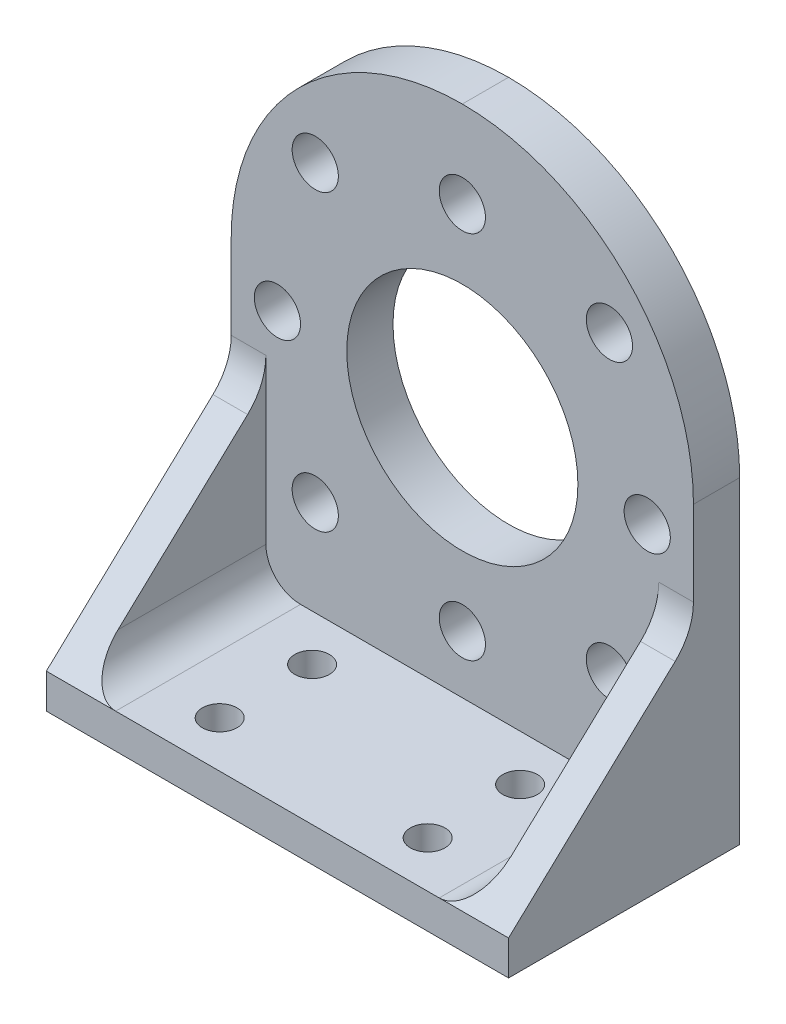
ISO-10303-21;
HEADER;
FILE_DESCRIPTION(('STEP AP214'),'2;1');
FILE_NAME('part.step','',(''),(''),'','','');
FILE_SCHEMA(('AUTOMOTIVE_DESIGN { 1 0 10303 214 1 1 1 1 }'));
ENDSEC;
DATA;
#1=APPLICATION_CONTEXT('core data for automotive mechanical design processes');
#2=APPLICATION_PROTOCOL_DEFINITION('international standard','automotive_design',2000,#1);
#3=PRODUCT_CONTEXT('',#1,'mechanical');
#4=PRODUCT('Part','Part','',(#3));
#5=PRODUCT_RELATED_PRODUCT_CATEGORY('part','',(#4));
#6=PRODUCT_DEFINITION_FORMATION('','',#4);
#7=PRODUCT_DEFINITION_CONTEXT('part definition',#1,'design');
#8=PRODUCT_DEFINITION('design','',#6,#7);
#9=PRODUCT_DEFINITION_SHAPE('','',#8);
#10=(LENGTH_UNIT() NAMED_UNIT(*) SI_UNIT(.MILLI.,.METRE.));
#11=(NAMED_UNIT(*) PLANE_ANGLE_UNIT() SI_UNIT($,.RADIAN.));
#12=(NAMED_UNIT(*) SI_UNIT($,.STERADIAN.) SOLID_ANGLE_UNIT());
#13=UNCERTAINTY_MEASURE_WITH_UNIT(LENGTH_MEASURE(1.E-05),#10,'distance_accuracy_value','');
#14=(GEOMETRIC_REPRESENTATION_CONTEXT(3) GLOBAL_UNCERTAINTY_ASSIGNED_CONTEXT((#13)) GLOBAL_UNIT_ASSIGNED_CONTEXT((#10,
#11,#12)) REPRESENTATION_CONTEXT('',''));
#15=CARTESIAN_POINT('',(0.,0.,0.));
#16=DIRECTION('',(0.,0.,1.));
#17=DIRECTION('',(1.,0.,0.));
#18=AXIS2_PLACEMENT_3D('',#15,#16,#17);
#19=CARTESIAN_POINT('',(0.,3.,0.));
#20=DIRECTION('',(0.,-1.,0.));
#21=DIRECTION('',(0.,0.,-1.));
#22=AXIS2_PLACEMENT_3D('',#19,#20,#21);
#23=PLANE('',#22);
#24=CARTESIAN_POINT('',(-9.,3.,6.));
#25=DIRECTION('',(0.,1.,0.));
#26=DIRECTION('',(0.,0.,-1.));
#27=AXIS2_PLACEMENT_3D('',#24,#25,#26);
#28=CIRCLE('',#27,1.5);
#29=CARTESIAN_POINT('',(-9.,3.,4.49999999999999));
#30=VERTEX_POINT('',#29);
#31=EDGE_CURVE('E618',#30,#30,#28,.T.);
#32=ORIENTED_EDGE('',*,*,#31,.F.);
#33=EDGE_LOOP('',(#32));
#34=FACE_BOUND('',#33,.T.);
#35=CARTESIAN_POINT('',(9.,3.,6.));
#36=DIRECTION('',(0.,1.,0.));
#37=DIRECTION('',(0.,0.,1.));
#38=AXIS2_PLACEMENT_3D('',#35,#36,#37);
#39=CIRCLE('',#38,1.49999999999999);
#40=CARTESIAN_POINT('',(9.,3.,7.49999999999999));
#41=VERTEX_POINT('',#40);
#42=EDGE_CURVE('E648',#41,#41,#39,.T.);
#43=ORIENTED_EDGE('',*,*,#42,.F.);
#44=EDGE_LOOP('',(#43));
#45=FACE_BOUND('',#44,.T.);
#46=CARTESIAN_POINT('',(9.,3.,-2.));
#47=DIRECTION('',(0.,1.,0.));
#48=DIRECTION('',(0.,0.,-1.));
#49=AXIS2_PLACEMENT_3D('',#46,#47,#48);
#50=CIRCLE('',#49,1.49999999999999);
#51=CARTESIAN_POINT('',(9.,3.,-3.49999999999999));
#52=VERTEX_POINT('',#51);
#53=EDGE_CURVE('E642',#52,#52,#50,.T.);
#54=ORIENTED_EDGE('',*,*,#53,.F.);
#55=EDGE_LOOP('',(#54));
#56=FACE_BOUND('',#55,.T.);
#57=CARTESIAN_POINT('',(-9.,3.,-2.));
#58=DIRECTION('',(0.,1.,0.));
#59=DIRECTION('',(0.,0.,1.));
#60=AXIS2_PLACEMENT_3D('',#57,#58,#59);
#61=CIRCLE('',#60,1.5);
#62=CARTESIAN_POINT('',(-9.,3.,-0.500000000000004));
#63=VERTEX_POINT('',#62);
#64=EDGE_CURVE('E641',#63,#63,#61,.T.);
#65=ORIENTED_EDGE('',*,*,#64,.F.);
#66=EDGE_LOOP('',(#65));
#67=FACE_BOUND('',#66,.T.);
#68=DIRECTION('',(1.,0.,0.));
#69=VECTOR('',#68,1.);
#70=CARTESIAN_POINT('',(-20.,3.,10.));
#71=LINE('',#70,#69);
#72=CARTESIAN_POINT('',(-14.,3.,9.99999999999999));
#73=VERTEX_POINT('',#72);
#74=CARTESIAN_POINT('',(14.,3.,10.));
#75=VERTEX_POINT('',#74);
#76=EDGE_CURVE('E159',#73,#75,#71,.T.);
#77=ORIENTED_EDGE('',*,*,#76,.T.);
#78=DIRECTION('',(0.,0.,1.));
#79=VECTOR('',#78,1.);
#80=CARTESIAN_POINT('',(14.,3.,-6.));
#81=LINE('',#80,#79);
#82=CARTESIAN_POINT('',(14.,3.,-6.));
#83=VERTEX_POINT('',#82);
#84=EDGE_CURVE('E212',#75,#83,#81,.F.);
#85=ORIENTED_EDGE('',*,*,#84,.T.);
#86=DIRECTION('',(1.,0.,0.));
#87=VECTOR('',#86,1.);
#88=CARTESIAN_POINT('',(-20.,3.,-6.));
#89=LINE('',#88,#87);
#90=CARTESIAN_POINT('',(-14.,3.,-6.));
#91=VERTEX_POINT('',#90);
#92=EDGE_CURVE('E270',#91,#83,#89,.T.);
#93=ORIENTED_EDGE('',*,*,#92,.F.);
#94=DIRECTION('',(0.,0.,-1.));
#95=VECTOR('',#94,1.);
#96=CARTESIAN_POINT('',(-14.,3.,9.99999999999999));
#97=LINE('',#96,#95);
#98=EDGE_CURVE('E209',#91,#73,#97,.F.);
#99=ORIENTED_EDGE('',*,*,#98,.T.);
#100=EDGE_LOOP('',(#77,#85,#93,#99));
#101=FACE_BOUND('',#100,.T.);
#102=ADVANCED_FACE('F38',(#34,#45,#56,#67,#101),#23,.F.);
#103=CARTESIAN_POINT('',(-20.,47.5,-6.));
#104=DIRECTION('',(0.,0.,-1.));
#105=DIRECTION('',(-1.,0.,0.));
#106=AXIS2_PLACEMENT_3D('',#103,#104,#105);
#107=PLANE('',#106);
#108=CARTESIAN_POINT('',(0.,40.,-6.));
#109=DIRECTION('',(0.,0.,1.));
#110=DIRECTION('',(1.,0.,0.));
#111=AXIS2_PLACEMENT_3D('',#108,#109,#110);
#112=CIRCLE('',#111,2.);
#113=CARTESIAN_POINT('',(2.,40.,-6.));
#114=VERTEX_POINT('',#113);
#115=EDGE_CURVE('E615',#114,#114,#112,.T.);
#116=ORIENTED_EDGE('',*,*,#115,.F.);
#117=EDGE_LOOP('',(#116));
#118=FACE_BOUND('',#117,.T.);
#119=CARTESIAN_POINT('',(-15.9999999999998,23.9999999999997,-6.));
#120=DIRECTION('',(0.,0.,1.));
#121=DIRECTION('',(1.,0.,0.));
#122=AXIS2_PLACEMENT_3D('',#119,#120,#121);
#123=CIRCLE('',#122,2.);
#124=CARTESIAN_POINT('',(-13.9999999999998,23.9999999999997,-6.));
#125=VERTEX_POINT('',#124);
#126=EDGE_CURVE('E621',#125,#125,#123,.T.);
#127=ORIENTED_EDGE('',*,*,#126,.F.);
#128=EDGE_LOOP('',(#127));
#129=FACE_BOUND('',#128,.T.);
#130=CARTESIAN_POINT('',(0.,8.,-6.));
#131=DIRECTION('',(0.,0.,1.));
#132=DIRECTION('',(1.,0.,0.));
#133=AXIS2_PLACEMENT_3D('',#130,#131,#132);
#134=CIRCLE('',#133,1.99999999999946);
#135=CARTESIAN_POINT('',(1.99999999999946,8.,-6.));
#136=VERTEX_POINT('',#135);
#137=EDGE_CURVE('E629',#136,#136,#134,.T.);
#138=ORIENTED_EDGE('',*,*,#137,.F.);
#139=EDGE_LOOP('',(#138));
#140=FACE_BOUND('',#139,.T.);
#141=CARTESIAN_POINT('',(16.0000000000002,24.0000000000004,-6.));
#142=DIRECTION('',(0.,0.,1.));
#143=DIRECTION('',(1.,0.,0.));
#144=AXIS2_PLACEMENT_3D('',#141,#142,#143);
#145=CIRCLE('',#144,2.);
#146=CARTESIAN_POINT('',(18.0000000000002,24.0000000000004,-6.));
#147=VERTEX_POINT('',#146);
#148=EDGE_CURVE('E635',#147,#147,#145,.T.);
#149=ORIENTED_EDGE('',*,*,#148,.F.);
#150=EDGE_LOOP('',(#149));
#151=FACE_BOUND('',#150,.T.);
#152=CARTESIAN_POINT('',(0.,24.,-6.));
#153=DIRECTION('',(0.,0.,1.));
#154=DIRECTION('',(1.,0.,0.));
#155=AXIS2_PLACEMENT_3D('',#152,#153,#154);
#156=CIRCLE('',#155,10.);
#157=CARTESIAN_POINT('',(10.,24.,-6.));
#158=VERTEX_POINT('',#157);
#159=EDGE_CURVE('E246',#158,#158,#156,.T.);
#160=ORIENTED_EDGE('',*,*,#159,.F.);
#161=EDGE_LOOP('',(#160));
#162=FACE_BOUND('',#161,.T.);
#163=CARTESIAN_POINT('',(-12.7279220613579,11.2720779386422,-6.));
#164=DIRECTION('',(0.,0.,1.));
#165=DIRECTION('',(1.,0.,0.));
#166=AXIS2_PLACEMENT_3D('',#163,#164,#165);
#167=CIRCLE('',#166,2.);
#168=CARTESIAN_POINT('',(-10.7279220613579,11.2720779386422,-6.));
#169=VERTEX_POINT('',#168);
#170=EDGE_CURVE('E259',#169,#169,#167,.T.);
#171=ORIENTED_EDGE('',*,*,#170,.F.);
#172=EDGE_LOOP('',(#171));
#173=FACE_BOUND('',#172,.T.);
#174=CARTESIAN_POINT('',(12.7279220613578,11.2720779386421,-6.));
#175=DIRECTION('',(0.,0.,1.));
#176=DIRECTION('',(1.,0.,0.));
#177=AXIS2_PLACEMENT_3D('',#174,#175,#176);
#178=CIRCLE('',#177,2.00000000000006);
#179=CARTESIAN_POINT('',(14.7279220613579,11.2720779386421,-6.));
#180=VERTEX_POINT('',#179);
#181=EDGE_CURVE('E253',#180,#180,#178,.T.);
#182=ORIENTED_EDGE('',*,*,#181,.F.);
#183=EDGE_LOOP('',(#182));
#184=FACE_BOUND('',#183,.T.);
#185=ORIENTED_EDGE('',*,*,#92,.T.);
#186=CARTESIAN_POINT('',(14.,6.,-6.));
#187=DIRECTION('',(0.,0.,-1.));
#188=DIRECTION('',(-1.,0.,0.));
#189=AXIS2_PLACEMENT_3D('',#186,#187,#188);
#190=CIRCLE('',#189,3.);
#191=CARTESIAN_POINT('',(17.,6.,-6.));
#192=VERTEX_POINT('',#191);
#193=EDGE_CURVE('E216',#83,#192,#190,.F.);
#194=ORIENTED_EDGE('',*,*,#193,.T.);
#195=DIRECTION('',(0.,-1.,0.));
#196=VECTOR('',#195,1.);
#197=CARTESIAN_POINT('',(17.,18.,-6.));
#198=LINE('',#197,#196);
#199=CARTESIAN_POINT('',(17.,20.1661600623316,-6.));
#200=VERTEX_POINT('',#199);
#201=EDGE_CURVE('E237',#200,#192,#198,.T.);
#202=ORIENTED_EDGE('',*,*,#201,.F.);
#203=DIRECTION('',(-1.,0.,0.));
#204=VECTOR('',#203,1.);
#205=CARTESIAN_POINT('',(20.,20.1661600623316,-6.));
#206=LINE('',#205,#204);
#207=CARTESIAN_POINT('',(20.,20.1661600623316,-6.));
#208=VERTEX_POINT('',#207);
#209=EDGE_CURVE('E193',#200,#208,#206,.F.);
#210=ORIENTED_EDGE('',*,*,#209,.T.);
#211=DIRECTION('',(0.,-1.,0.));
#212=VECTOR('',#211,1.);
#213=CARTESIAN_POINT('',(20.,47.5,-6.));
#214=LINE('',#213,#212);
#215=CARTESIAN_POINT('',(20.,27.5,-6.));
#216=VERTEX_POINT('',#215);
#217=EDGE_CURVE('E274',#216,#208,#214,.T.);
#218=ORIENTED_EDGE('',*,*,#217,.F.);
#219=CARTESIAN_POINT('',(0.,27.5,-6.));
#220=DIRECTION('',(0.,0.,-1.));
#221=DIRECTION('',(-1.,0.,0.));
#222=AXIS2_PLACEMENT_3D('',#219,#220,#221);
#223=CIRCLE('',#222,20.);
#224=CARTESIAN_POINT('',(0.,47.5,-6.));
#225=VERTEX_POINT('',#224);
#226=EDGE_CURVE('E179',#216,#225,#223,.F.);
#227=ORIENTED_EDGE('',*,*,#226,.T.);
#228=CARTESIAN_POINT('',(0.,27.5,-6.));
#229=DIRECTION('',(0.,0.,-1.));
#230=DIRECTION('',(-1.,0.,0.));
#231=AXIS2_PLACEMENT_3D('',#228,#229,#230);
#232=CIRCLE('',#231,20.);
#233=CARTESIAN_POINT('',(-20.,27.5,-6.));
#234=VERTEX_POINT('',#233);
#235=EDGE_CURVE('E177',#225,#234,#232,.F.);
#236=ORIENTED_EDGE('',*,*,#235,.T.);
#237=DIRECTION('',(0.,-1.,0.));
#238=VECTOR('',#237,1.);
#239=CARTESIAN_POINT('',(-20.,47.5,-6.));
#240=LINE('',#239,#238);
#241=CARTESIAN_POINT('',(-20.,20.1661600623316,-6.));
#242=VERTEX_POINT('',#241);
#243=EDGE_CURVE('E276',#234,#242,#240,.T.);
#244=ORIENTED_EDGE('',*,*,#243,.T.);
#245=DIRECTION('',(-1.,0.,0.));
#246=VECTOR('',#245,1.);
#247=CARTESIAN_POINT('',(-17.,20.1661600623316,-6.));
#248=LINE('',#247,#246);
#249=CARTESIAN_POINT('',(-17.,20.1661600623316,-6.));
#250=VERTEX_POINT('',#249);
#251=EDGE_CURVE('E190',#242,#250,#248,.F.);
#252=ORIENTED_EDGE('',*,*,#251,.T.);
#253=DIRECTION('',(0.,-1.,0.));
#254=VECTOR('',#253,1.);
#255=CARTESIAN_POINT('',(-17.,18.,-6.));
#256=LINE('',#255,#254);
#257=CARTESIAN_POINT('',(-17.,6.,-6.));
#258=VERTEX_POINT('',#257);
#259=EDGE_CURVE('E188',#250,#258,#256,.T.);
#260=ORIENTED_EDGE('',*,*,#259,.T.);
#261=CARTESIAN_POINT('',(-14.,6.,-6.));
#262=DIRECTION('',(0.,0.,-1.));
#263=DIRECTION('',(-1.,0.,0.));
#264=AXIS2_PLACEMENT_3D('',#261,#262,#263);
#265=CIRCLE('',#264,3.);
#266=EDGE_CURVE('E214',#258,#91,#265,.F.);
#267=ORIENTED_EDGE('',*,*,#266,.T.);
#268=EDGE_LOOP('',(#185,#194,#202,#210,#218,#227,#236,#244,#252,#260,#267));
#269=FACE_BOUND('',#268,.T.);
#270=CARTESIAN_POINT('',(12.7279220613579,36.7279220613578,-6.));
#271=DIRECTION('',(0.,0.,1.));
#272=DIRECTION('',(1.,0.,0.));
#273=AXIS2_PLACEMENT_3D('',#270,#271,#272);
#274=CIRCLE('',#273,1.99999999999998);
#275=CARTESIAN_POINT('',(14.7279220613579,36.7279220613578,-6.));
#276=VERTEX_POINT('',#275);
#277=EDGE_CURVE('E247',#276,#276,#274,.T.);
#278=ORIENTED_EDGE('',*,*,#277,.F.);
#279=EDGE_LOOP('',(#278));
#280=FACE_BOUND('',#279,.T.);
#281=CARTESIAN_POINT('',(-12.7279220613578,36.7279220613579,-6.));
#282=DIRECTION('',(0.,0.,1.));
#283=DIRECTION('',(1.,0.,0.));
#284=AXIS2_PLACEMENT_3D('',#281,#282,#283);
#285=CIRCLE('',#284,1.99999999999995);
#286=CARTESIAN_POINT('',(-10.7279220613579,36.7279220613579,-6.));
#287=VERTEX_POINT('',#286);
#288=EDGE_CURVE('E187',#287,#287,#285,.T.);
#289=ORIENTED_EDGE('',*,*,#288,.F.);
#290=EDGE_LOOP('',(#289));
#291=FACE_BOUND('',#290,.T.);
#292=ADVANCED_FACE('F231',(#118,#129,#140,#151,#162,#173,#184,#269,#280,#291),#107,.F.);
#293=CARTESIAN_POINT('',(20.,3.,10.));
#294=DIRECTION('',(-1.,0.,0.));
#295=DIRECTION('',(0.,0.,1.));
#296=AXIS2_PLACEMENT_3D('',#293,#294,#295);
#297=PLANE('',#296);
#298=ORIENTED_EDGE('',*,*,#217,.T.);
#299=CARTESIAN_POINT('',(20.,20.1661600623316,-0.999999999999998));
#300=DIRECTION('',(-1.,0.,0.));
#301=DIRECTION('',(0.,0.,1.));
#302=AXIS2_PLACEMENT_3D('',#299,#300,#301);
#303=CIRCLE('',#302,5.);
#304=CARTESIAN_POINT('',(20.,16.5184740416312,-4.41970564440665));
#305=VERTEX_POINT('',#304);
#306=EDGE_CURVE('E141',#208,#305,#303,.T.);
#307=ORIENTED_EDGE('',*,*,#306,.T.);
#308=DIRECTION('',(0.,-0.68394112888133,0.729537204140085));
#309=VECTOR('',#308,1.);
#310=CARTESIAN_POINT('',(20.,18.,-6.00000000000001));
#311=LINE('',#310,#309);
#312=CARTESIAN_POINT('',(20.,3.,9.99999999999999));
#313=VERTEX_POINT('',#312);
#314=EDGE_CURVE('E134',#305,#313,#311,.T.);
#315=ORIENTED_EDGE('',*,*,#314,.T.);
#316=DIRECTION('',(0.,-1.,0.));
#317=VECTOR('',#316,1.);
#318=CARTESIAN_POINT('',(20.,3.,10.));
#319=LINE('',#318,#317);
#320=CARTESIAN_POINT('',(20.,0.,10.));
#321=VERTEX_POINT('',#320);
#322=EDGE_CURVE('E138',#313,#321,#319,.T.);
#323=ORIENTED_EDGE('',*,*,#322,.T.);
#324=DIRECTION('',(0.,0.,-1.));
#325=VECTOR('',#324,1.);
#326=CARTESIAN_POINT('',(20.,0.,10.));
#327=LINE('',#326,#325);
#328=CARTESIAN_POINT('',(20.,0.,-10.));
#329=VERTEX_POINT('',#328);
#330=EDGE_CURVE('E277',#321,#329,#327,.T.);
#331=ORIENTED_EDGE('',*,*,#330,.T.);
#332=DIRECTION('',(0.,-1.,0.));
#333=VECTOR('',#332,1.);
#334=CARTESIAN_POINT('',(20.,3.,-10.));
#335=LINE('',#334,#333);
#336=CARTESIAN_POINT('',(20.,27.5,-10.));
#337=VERTEX_POINT('',#336);
#338=EDGE_CURVE('E168',#337,#329,#335,.T.);
#339=ORIENTED_EDGE('',*,*,#338,.F.);
#340=DIRECTION('',(0.,0.,-1.));
#341=VECTOR('',#340,1.);
#342=CARTESIAN_POINT('',(20.,27.5,-6.));
#343=LINE('',#342,#341);
#344=EDGE_CURVE('E174',#337,#216,#343,.F.);
#345=ORIENTED_EDGE('',*,*,#344,.T.);
#346=EDGE_LOOP('',(#298,#307,#315,#323,#331,#339,#345));
#347=FACE_BOUND('',#346,.T.);
#348=ADVANCED_FACE('F136',(#347),#297,.F.);
#349=CARTESIAN_POINT('',(-20.,3.,-10.));
#350=DIRECTION('',(0.,0.,1.));
#351=DIRECTION('',(1.,0.,0.));
#352=AXIS2_PLACEMENT_3D('',#349,#350,#351);
#353=PLANE('',#352);
#354=CARTESIAN_POINT('',(0.,40.,-10.));
#355=DIRECTION('',(0.,0.,1.));
#356=DIRECTION('',(1.,0.,0.));
#357=AXIS2_PLACEMENT_3D('',#354,#355,#356);
#358=CIRCLE('',#357,2.);
#359=CARTESIAN_POINT('',(2.,40.,-10.));
#360=VERTEX_POINT('',#359);
#361=EDGE_CURVE('E612',#360,#360,#358,.T.);
#362=ORIENTED_EDGE('',*,*,#361,.T.);
#363=EDGE_LOOP('',(#362));
#364=FACE_BOUND('',#363,.T.);
#365=CARTESIAN_POINT('',(-15.9999999999998,23.9999999999997,-10.));
#366=DIRECTION('',(0.,0.,1.));
#367=DIRECTION('',(1.,0.,0.));
#368=AXIS2_PLACEMENT_3D('',#365,#366,#367);
#369=CIRCLE('',#368,2.);
#370=CARTESIAN_POINT('',(-13.9999999999998,23.9999999999997,-10.));
#371=VERTEX_POINT('',#370);
#372=EDGE_CURVE('E616',#371,#371,#369,.T.);
#373=ORIENTED_EDGE('',*,*,#372,.T.);
#374=EDGE_LOOP('',(#373));
#375=FACE_BOUND('',#374,.T.);
#376=CARTESIAN_POINT('',(0.,8.,-10.));
#377=DIRECTION('',(0.,0.,1.));
#378=DIRECTION('',(1.,0.,0.));
#379=AXIS2_PLACEMENT_3D('',#376,#377,#378);
#380=CIRCLE('',#379,1.99999999999946);
#381=CARTESIAN_POINT('',(1.99999999999946,8.,-10.));
#382=VERTEX_POINT('',#381);
#383=EDGE_CURVE('E626',#382,#382,#380,.T.);
#384=ORIENTED_EDGE('',*,*,#383,.T.);
#385=EDGE_LOOP('',(#384));
#386=FACE_BOUND('',#385,.T.);
#387=CARTESIAN_POINT('',(16.0000000000002,24.0000000000004,-10.));
#388=DIRECTION('',(0.,0.,1.));
#389=DIRECTION('',(1.,0.,0.));
#390=AXIS2_PLACEMENT_3D('',#387,#388,#389);
#391=CIRCLE('',#390,2.);
#392=CARTESIAN_POINT('',(18.0000000000002,24.0000000000004,-10.));
#393=VERTEX_POINT('',#392);
#394=EDGE_CURVE('E632',#393,#393,#391,.T.);
#395=ORIENTED_EDGE('',*,*,#394,.T.);
#396=EDGE_LOOP('',(#395));
#397=FACE_BOUND('',#396,.T.);
#398=CARTESIAN_POINT('',(-12.7279220613578,36.7279220613579,-10.));
#399=DIRECTION('',(0.,0.,1.));
#400=DIRECTION('',(1.,0.,0.));
#401=AXIS2_PLACEMENT_3D('',#398,#399,#400);
#402=CIRCLE('',#401,1.99999999999995);
#403=CARTESIAN_POINT('',(-10.7279220613579,36.7279220613579,-10.));
#404=VERTEX_POINT('',#403);
#405=EDGE_CURVE('E262',#404,#404,#402,.T.);
#406=ORIENTED_EDGE('',*,*,#405,.T.);
#407=EDGE_LOOP('',(#406));
#408=FACE_BOUND('',#407,.T.);
#409=CARTESIAN_POINT('',(-12.7279220613579,11.2720779386422,-10.));
#410=DIRECTION('',(0.,0.,1.));
#411=DIRECTION('',(1.,0.,0.));
#412=AXIS2_PLACEMENT_3D('',#409,#410,#411);
#413=CIRCLE('',#412,2.);
#414=CARTESIAN_POINT('',(-10.7279220613579,11.2720779386422,-10.));
#415=VERTEX_POINT('',#414);
#416=EDGE_CURVE('E256',#415,#415,#413,.T.);
#417=ORIENTED_EDGE('',*,*,#416,.T.);
#418=EDGE_LOOP('',(#417));
#419=FACE_BOUND('',#418,.T.);
#420=CARTESIAN_POINT('',(12.7279220613578,11.2720779386421,-10.));
#421=DIRECTION('',(0.,0.,1.));
#422=DIRECTION('',(1.,0.,0.));
#423=AXIS2_PLACEMENT_3D('',#420,#421,#422);
#424=CIRCLE('',#423,2.00000000000006);
#425=CARTESIAN_POINT('',(14.7279220613579,11.2720779386421,-10.));
#426=VERTEX_POINT('',#425);
#427=EDGE_CURVE('E250',#426,#426,#424,.T.);
#428=ORIENTED_EDGE('',*,*,#427,.T.);
#429=EDGE_LOOP('',(#428));
#430=FACE_BOUND('',#429,.T.);
#431=CARTESIAN_POINT('',(12.7279220613579,36.7279220613578,-10.));
#432=DIRECTION('',(0.,0.,1.));
#433=DIRECTION('',(1.,0.,0.));
#434=AXIS2_PLACEMENT_3D('',#431,#432,#433);
#435=CIRCLE('',#434,1.99999999999998);
#436=CARTESIAN_POINT('',(14.7279220613579,36.7279220613578,-10.));
#437=VERTEX_POINT('',#436);
#438=EDGE_CURVE('E243',#437,#437,#435,.T.);
#439=ORIENTED_EDGE('',*,*,#438,.T.);
#440=EDGE_LOOP('',(#439));
#441=FACE_BOUND('',#440,.T.);
#442=CARTESIAN_POINT('',(0.,24.,-10.));
#443=DIRECTION('',(0.,0.,1.));
#444=DIRECTION('',(1.,0.,0.));
#445=AXIS2_PLACEMENT_3D('',#442,#443,#444);
#446=CIRCLE('',#445,10.);
#447=CARTESIAN_POINT('',(10.,24.,-10.));
#448=VERTEX_POINT('',#447);
#449=EDGE_CURVE('E267',#448,#448,#446,.T.);
#450=ORIENTED_EDGE('',*,*,#449,.T.);
#451=EDGE_LOOP('',(#450));
#452=FACE_BOUND('',#451,.T.);
#453=CARTESIAN_POINT('',(0.,27.5,-10.));
#454=DIRECTION('',(0.,0.,1.));
#455=DIRECTION('',(1.,0.,0.));
#456=AXIS2_PLACEMENT_3D('',#453,#454,#455);
#457=CIRCLE('',#456,20.);
#458=CARTESIAN_POINT('',(-20.,27.5,-10.));
#459=VERTEX_POINT('',#458);
#460=CARTESIAN_POINT('',(0.,47.5,-10.));
#461=VERTEX_POINT('',#460);
#462=EDGE_CURVE('E170',#459,#461,#457,.F.);
#463=ORIENTED_EDGE('',*,*,#462,.T.);
#464=CARTESIAN_POINT('',(0.,27.5,-10.));
#465=DIRECTION('',(0.,0.,1.));
#466=DIRECTION('',(1.,0.,0.));
#467=AXIS2_PLACEMENT_3D('',#464,#465,#466);
#468=CIRCLE('',#467,20.);
#469=EDGE_CURVE('E172',#461,#337,#468,.F.);
#470=ORIENTED_EDGE('',*,*,#469,.T.);
#471=ORIENTED_EDGE('',*,*,#338,.T.);
#472=DIRECTION('',(-1.,0.,0.));
#473=VECTOR('',#472,1.);
#474=CARTESIAN_POINT('',(-20.,0.,-10.));
#475=LINE('',#474,#473);
#476=CARTESIAN_POINT('',(-20.,0.,-10.));
#477=VERTEX_POINT('',#476);
#478=EDGE_CURVE('E280',#329,#477,#475,.T.);
#479=ORIENTED_EDGE('',*,*,#478,.T.);
#480=DIRECTION('',(0.,-1.,0.));
#481=VECTOR('',#480,1.);
#482=CARTESIAN_POINT('',(-20.,3.,-10.));
#483=LINE('',#482,#481);
#484=EDGE_CURVE('E161',#459,#477,#483,.T.);
#485=ORIENTED_EDGE('',*,*,#484,.F.);
#486=EDGE_LOOP('',(#463,#470,#471,#479,#485));
#487=FACE_BOUND('',#486,.T.);
#488=ADVANCED_FACE('F307',(#364,#375,#386,#397,#408,#419,#430,#441,#452,#487),#353,.F.);
#489=CARTESIAN_POINT('',(-20.,3.,10.));
#490=DIRECTION('',(1.,0.,0.));
#491=DIRECTION('',(0.,0.,-1.));
#492=AXIS2_PLACEMENT_3D('',#489,#490,#491);
#493=PLANE('',#492);
#494=DIRECTION('',(0.,-1.,0.));
#495=VECTOR('',#494,1.);
#496=CARTESIAN_POINT('',(-20.,3.,10.));
#497=LINE('',#496,#495);
#498=CARTESIAN_POINT('',(-20.,3.,9.99999999999999));
#499=VERTEX_POINT('',#498);
#500=CARTESIAN_POINT('',(-20.,0.,10.));
#501=VERTEX_POINT('',#500);
#502=EDGE_CURVE('E158',#499,#501,#497,.T.);
#503=ORIENTED_EDGE('',*,*,#502,.F.);
#504=DIRECTION('',(0.,-0.68394112888133,0.729537204140085));
#505=VECTOR('',#504,1.);
#506=CARTESIAN_POINT('',(-20.,18.,-6.00000000000001));
#507=LINE('',#506,#505);
#508=CARTESIAN_POINT('',(-20.,16.5184740416312,-4.41970564440665));
#509=VERTEX_POINT('',#508);
#510=EDGE_CURVE('E146',#509,#499,#507,.T.);
#511=ORIENTED_EDGE('',*,*,#510,.F.);
#512=CARTESIAN_POINT('',(-20.,20.1661600623316,-0.999999999999999));
#513=DIRECTION('',(1.,0.,0.));
#514=DIRECTION('',(0.,0.,-1.));
#515=AXIS2_PLACEMENT_3D('',#512,#513,#514);
#516=CIRCLE('',#515,5.);
#517=EDGE_CURVE('E202',#509,#242,#516,.T.);
#518=ORIENTED_EDGE('',*,*,#517,.T.);
#519=ORIENTED_EDGE('',*,*,#243,.F.);
#520=DIRECTION('',(0.,0.,1.));
#521=VECTOR('',#520,1.);
#522=CARTESIAN_POINT('',(-20.,27.5,-10.));
#523=LINE('',#522,#521);
#524=EDGE_CURVE('E181',#234,#459,#523,.F.);
#525=ORIENTED_EDGE('',*,*,#524,.T.);
#526=ORIENTED_EDGE('',*,*,#484,.T.);
#527=DIRECTION('',(0.,0.,1.));
#528=VECTOR('',#527,1.);
#529=CARTESIAN_POINT('',(-20.,0.,10.));
#530=LINE('',#529,#528);
#531=EDGE_CURVE('E282',#477,#501,#530,.T.);
#532=ORIENTED_EDGE('',*,*,#531,.T.);
#533=EDGE_LOOP('',(#503,#511,#518,#519,#525,#526,#532));
#534=FACE_BOUND('',#533,.T.);
#535=ADVANCED_FACE('F287',(#534),#493,.F.);
#536=CARTESIAN_POINT('',(-20.,3.,10.));
#537=DIRECTION('',(0.,0.,-1.));
#538=DIRECTION('',(-1.,0.,0.));
#539=AXIS2_PLACEMENT_3D('',#536,#537,#538);
#540=PLANE('',#539);
#541=ORIENTED_EDGE('',*,*,#322,.F.);
#542=DIRECTION('',(-1.,0.,0.));
#543=VECTOR('',#542,1.);
#544=CARTESIAN_POINT('',(20.,3.,9.99999999999999));
#545=LINE('',#544,#543);
#546=EDGE_CURVE('E54',#313,#75,#545,.T.);
#547=ORIENTED_EDGE('',*,*,#546,.T.);
#548=ORIENTED_EDGE('',*,*,#76,.F.);
#549=EDGE_CURVE('E145',#73,#499,#545,.T.);
#550=ORIENTED_EDGE('',*,*,#549,.T.);
#551=ORIENTED_EDGE('',*,*,#502,.T.);
#552=DIRECTION('',(1.,0.,0.));
#553=VECTOR('',#552,1.);
#554=CARTESIAN_POINT('',(-20.,0.,10.));
#555=LINE('',#554,#553);
#556=EDGE_CURVE('E156',#501,#321,#555,.T.);
#557=ORIENTED_EDGE('',*,*,#556,.T.);
#558=EDGE_LOOP('',(#541,#547,#548,#550,#551,#557));
#559=FACE_BOUND('',#558,.T.);
#560=ADVANCED_FACE('F154',(#559),#540,.F.);
#561=CARTESIAN_POINT('',(0.,0.,0.));
#562=DIRECTION('',(0.,-1.,0.));
#563=DIRECTION('',(0.,0.,-1.));
#564=AXIS2_PLACEMENT_3D('',#561,#562,#563);
#565=PLANE('',#564);
#566=CARTESIAN_POINT('',(-9.,0.,6.));
#567=DIRECTION('',(0.,1.,0.));
#568=DIRECTION('',(0.,0.,-1.));
#569=AXIS2_PLACEMENT_3D('',#566,#567,#568);
#570=CIRCLE('',#569,1.5);
#571=CARTESIAN_POINT('',(-9.,0.,4.49999999999999));
#572=VERTEX_POINT('',#571);
#573=EDGE_CURVE('E651',#572,#572,#570,.T.);
#574=ORIENTED_EDGE('',*,*,#573,.T.);
#575=EDGE_LOOP('',(#574));
#576=FACE_BOUND('',#575,.T.);
#577=CARTESIAN_POINT('',(9.,0.,6.));
#578=DIRECTION('',(0.,1.,0.));
#579=DIRECTION('',(0.,0.,1.));
#580=AXIS2_PLACEMENT_3D('',#577,#578,#579);
#581=CIRCLE('',#580,1.49999999999999);
#582=CARTESIAN_POINT('',(9.,0.,7.49999999999999));
#583=VERTEX_POINT('',#582);
#584=EDGE_CURVE('E645',#583,#583,#581,.T.);
#585=ORIENTED_EDGE('',*,*,#584,.T.);
#586=EDGE_LOOP('',(#585));
#587=FACE_BOUND('',#586,.T.);
#588=CARTESIAN_POINT('',(9.,0.,-2.));
#589=DIRECTION('',(0.,1.,0.));
#590=DIRECTION('',(0.,0.,-1.));
#591=AXIS2_PLACEMENT_3D('',#588,#589,#590);
#592=CIRCLE('',#591,1.49999999999999);
#593=CARTESIAN_POINT('',(9.,0.,-3.49999999999999));
#594=VERTEX_POINT('',#593);
#595=EDGE_CURVE('E638',#594,#594,#592,.T.);
#596=ORIENTED_EDGE('',*,*,#595,.T.);
#597=EDGE_LOOP('',(#596));
#598=FACE_BOUND('',#597,.T.);
#599=CARTESIAN_POINT('',(-9.,0.,-2.));
#600=DIRECTION('',(0.,1.,0.));
#601=DIRECTION('',(0.,0.,1.));
#602=AXIS2_PLACEMENT_3D('',#599,#600,#601);
#603=CIRCLE('',#602,1.5);
#604=CARTESIAN_POINT('',(-9.,0.,-0.500000000000004));
#605=VERTEX_POINT('',#604);
#606=EDGE_CURVE('E656',#605,#605,#603,.T.);
#607=ORIENTED_EDGE('',*,*,#606,.T.);
#608=EDGE_LOOP('',(#607));
#609=FACE_BOUND('',#608,.T.);
#610=ORIENTED_EDGE('',*,*,#330,.F.);
#611=ORIENTED_EDGE('',*,*,#556,.F.);
#612=ORIENTED_EDGE('',*,*,#531,.F.);
#613=ORIENTED_EDGE('',*,*,#478,.F.);
#614=EDGE_LOOP('',(#610,#611,#612,#613));
#615=FACE_BOUND('',#614,.T.);
#616=ADVANCED_FACE('F292',(#576,#587,#598,#609,#615),#565,.T.);
#617=CARTESIAN_POINT('',(0.,24.,-10.));
#618=DIRECTION('',(0.,0.,1.));
#619=DIRECTION('',(1.,0.,0.));
#620=AXIS2_PLACEMENT_3D('',#617,#618,#619);
#621=CYLINDRICAL_SURFACE('',#620,10.);
#622=ORIENTED_EDGE('',*,*,#449,.F.);
#623=EDGE_LOOP('',(#622));
#624=FACE_BOUND('',#623,.T.);
#625=ORIENTED_EDGE('',*,*,#159,.T.);
#626=EDGE_LOOP('',(#625));
#627=FACE_BOUND('',#626,.T.);
#628=ADVANCED_FACE('F335',(#624,#627),#621,.F.);
#629=CARTESIAN_POINT('',(12.7279220613579,36.7279220613578,-10.));
#630=DIRECTION('',(0.,0.,1.));
#631=DIRECTION('',(1.,0.,0.));
#632=AXIS2_PLACEMENT_3D('',#629,#630,#631);
#633=CYLINDRICAL_SURFACE('',#632,1.99999999999998);
#634=ORIENTED_EDGE('',*,*,#438,.F.);
#635=EDGE_LOOP('',(#634));
#636=FACE_BOUND('',#635,.T.);
#637=ORIENTED_EDGE('',*,*,#277,.T.);
#638=EDGE_LOOP('',(#637));
#639=FACE_BOUND('',#638,.T.);
#640=ADVANCED_FACE('F355',(#636,#639),#633,.F.);
#641=CARTESIAN_POINT('',(12.7279220613578,11.2720779386421,-10.));
#642=DIRECTION('',(0.,0.,1.));
#643=DIRECTION('',(1.,0.,0.));
#644=AXIS2_PLACEMENT_3D('',#641,#642,#643);
#645=CYLINDRICAL_SURFACE('',#644,2.00000000000006);
#646=ORIENTED_EDGE('',*,*,#427,.F.);
#647=EDGE_LOOP('',(#646));
#648=FACE_BOUND('',#647,.T.);
#649=ORIENTED_EDGE('',*,*,#181,.T.);
#650=EDGE_LOOP('',(#649));
#651=FACE_BOUND('',#650,.T.);
#652=ADVANCED_FACE('F364',(#648,#651),#645,.F.);
#653=CARTESIAN_POINT('',(-12.7279220613579,11.2720779386422,-10.));
#654=DIRECTION('',(0.,0.,1.));
#655=DIRECTION('',(1.,0.,0.));
#656=AXIS2_PLACEMENT_3D('',#653,#654,#655);
#657=CYLINDRICAL_SURFACE('',#656,2.);
#658=ORIENTED_EDGE('',*,*,#416,.F.);
#659=EDGE_LOOP('',(#658));
#660=FACE_BOUND('',#659,.T.);
#661=ORIENTED_EDGE('',*,*,#170,.T.);
#662=EDGE_LOOP('',(#661));
#663=FACE_BOUND('',#662,.T.);
#664=ADVANCED_FACE('F372',(#660,#663),#657,.F.);
#665=CARTESIAN_POINT('',(-12.7279220613578,36.7279220613579,-10.));
#666=DIRECTION('',(0.,0.,1.));
#667=DIRECTION('',(1.,0.,0.));
#668=AXIS2_PLACEMENT_3D('',#665,#666,#667);
#669=CYLINDRICAL_SURFACE('',#668,1.99999999999995);
#670=ORIENTED_EDGE('',*,*,#405,.F.);
#671=EDGE_LOOP('',(#670));
#672=FACE_BOUND('',#671,.T.);
#673=ORIENTED_EDGE('',*,*,#288,.T.);
#674=EDGE_LOOP('',(#673));
#675=FACE_BOUND('',#674,.T.);
#676=ADVANCED_FACE('F380',(#672,#675),#669,.F.);
#677=CARTESIAN_POINT('',(0.,27.5,0.));
#678=DIRECTION('',(0.,0.,-1.));
#679=DIRECTION('',(-1.,0.,0.));
#680=AXIS2_PLACEMENT_3D('',#677,#678,#679);
#681=CYLINDRICAL_SURFACE('',#680,20.);
#682=ORIENTED_EDGE('',*,*,#524,.F.);
#683=ORIENTED_EDGE('',*,*,#235,.F.);
#684=DIRECTION('',(0.,0.,1.));
#685=VECTOR('',#684,1.);
#686=CARTESIAN_POINT('',(0.,47.5,-6.));
#687=LINE('',#686,#685);
#688=EDGE_CURVE('E184',#461,#225,#687,.T.);
#689=ORIENTED_EDGE('',*,*,#688,.F.);
#690=ORIENTED_EDGE('',*,*,#462,.F.);
#691=EDGE_LOOP('',(#682,#683,#689,#690));
#692=FACE_BOUND('',#691,.T.);
#693=ADVANCED_FACE('F305',(#692),#681,.T.);
#694=CARTESIAN_POINT('',(0.,27.5,0.));
#695=DIRECTION('',(0.,0.,1.));
#696=DIRECTION('',(1.,0.,0.));
#697=AXIS2_PLACEMENT_3D('',#694,#695,#696);
#698=CYLINDRICAL_SURFACE('',#697,20.);
#699=ORIENTED_EDGE('',*,*,#226,.F.);
#700=ORIENTED_EDGE('',*,*,#344,.F.);
#701=ORIENTED_EDGE('',*,*,#469,.F.);
#702=ORIENTED_EDGE('',*,*,#688,.T.);
#703=EDGE_LOOP('',(#699,#700,#701,#702));
#704=FACE_BOUND('',#703,.T.);
#705=ADVANCED_FACE('F299',(#704),#698,.T.);
#706=CARTESIAN_POINT('',(-17.,18.,-6.));
#707=DIRECTION('',(-1.,0.,0.));
#708=DIRECTION('',(0.,0.,1.));
#709=AXIS2_PLACEMENT_3D('',#706,#707,#708);
#710=PLANE('',#709);
#711=DIRECTION('',(0.,-0.68394112888133,0.729537204140085));
#712=VECTOR('',#711,1.);
#713=CARTESIAN_POINT('',(-17.,18.,-6.));
#714=LINE('',#713,#712);
#715=CARTESIAN_POINT('',(-17.,16.5184740416312,-4.41970564440665));
#716=VERTEX_POINT('',#715);
#717=CARTESIAN_POINT('',(-17.,6.,6.8));
#718=VERTEX_POINT('',#717);
#719=EDGE_CURVE('E226',#716,#718,#714,.T.);
#720=ORIENTED_EDGE('',*,*,#719,.T.);
#721=DIRECTION('',(0.,0.,-1.));
#722=VECTOR('',#721,1.);
#723=CARTESIAN_POINT('',(-17.,6.,-6.));
#724=LINE('',#723,#722);
#725=EDGE_CURVE('E218',#718,#258,#724,.T.);
#726=ORIENTED_EDGE('',*,*,#725,.T.);
#727=ORIENTED_EDGE('',*,*,#259,.F.);
#728=CARTESIAN_POINT('',(-17.,20.1661600623316,-0.999999999999999));
#729=DIRECTION('',(-1.,0.,0.));
#730=DIRECTION('',(0.,0.,1.));
#731=AXIS2_PLACEMENT_3D('',#728,#729,#730);
#732=CIRCLE('',#731,5.);
#733=EDGE_CURVE('E204',#250,#716,#732,.T.);
#734=ORIENTED_EDGE('',*,*,#733,.T.);
#735=EDGE_LOOP('',(#720,#726,#727,#734));
#736=FACE_BOUND('',#735,.T.);
#737=ADVANCED_FACE('F224',(#736),#710,.F.);
#738=CARTESIAN_POINT('',(17.,18.,-6.));
#739=DIRECTION('',(1.,0.,0.));
#740=DIRECTION('',(0.,0.,-1.));
#741=AXIS2_PLACEMENT_3D('',#738,#739,#740);
#742=PLANE('',#741);
#743=ORIENTED_EDGE('',*,*,#201,.T.);
#744=DIRECTION('',(0.,0.,1.));
#745=VECTOR('',#744,1.);
#746=CARTESIAN_POINT('',(17.,6.,9.99999999999999));
#747=LINE('',#746,#745);
#748=CARTESIAN_POINT('',(17.,6.,6.8));
#749=VERTEX_POINT('',#748);
#750=EDGE_CURVE('E206',#192,#749,#747,.T.);
#751=ORIENTED_EDGE('',*,*,#750,.T.);
#752=DIRECTION('',(0.,0.68394112888133,-0.729537204140085));
#753=VECTOR('',#752,1.);
#754=CARTESIAN_POINT('',(17.,18.,-6.));
#755=LINE('',#754,#753);
#756=CARTESIAN_POINT('',(17.,16.5184740416312,-4.41970564440665));
#757=VERTEX_POINT('',#756);
#758=EDGE_CURVE('E152',#749,#757,#755,.T.);
#759=ORIENTED_EDGE('',*,*,#758,.T.);
#760=CARTESIAN_POINT('',(17.,20.1661600623316,-0.999999999999998));
#761=DIRECTION('',(1.,0.,0.));
#762=DIRECTION('',(0.,0.,-1.));
#763=AXIS2_PLACEMENT_3D('',#760,#761,#762);
#764=CIRCLE('',#763,5.);
#765=EDGE_CURVE('E198',#757,#200,#764,.T.);
#766=ORIENTED_EDGE('',*,*,#765,.T.);
#767=EDGE_LOOP('',(#743,#751,#759,#766));
#768=FACE_BOUND('',#767,.T.);
#769=ADVANCED_FACE('F405',(#768),#742,.F.);
#770=CARTESIAN_POINT('',(20.,18.,-6.00000000000001));
#771=DIRECTION('',(0.,-0.729537204140085,-0.68394112888133));
#772=DIRECTION('',(0.,0.68394112888133,-0.729537204140085));
#773=AXIS2_PLACEMENT_3D('',#770,#771,#772);
#774=PLANE('',#773);
#775=ORIENTED_EDGE('',*,*,#314,.F.);
#776=DIRECTION('',(-1.,0.,0.));
#777=VECTOR('',#776,1.);
#778=CARTESIAN_POINT('',(17.,16.5184740416312,-4.41970564440665));
#779=LINE('',#778,#777);
#780=EDGE_CURVE('E183',#305,#757,#779,.T.);
#781=ORIENTED_EDGE('',*,*,#780,.T.);
#782=ORIENTED_EDGE('',*,*,#758,.F.);
#783=CARTESIAN_POINT('',(14.,6.,6.79999999999999));
#784=DIRECTION('',(0.,-0.729537204140085,-0.68394112888133));
#785=DIRECTION('',(0.,0.68394112888133,-0.729537204140085));
#786=AXIS2_PLACEMENT_3D('',#783,#784,#785);
#787=ELLIPSE('',#786,4.38634243989226,3.);
#788=EDGE_CURVE('E47',#749,#75,#787,.T.);
#789=ORIENTED_EDGE('',*,*,#788,.T.);
#790=ORIENTED_EDGE('',*,*,#546,.F.);
#791=EDGE_LOOP('',(#775,#781,#782,#789,#790));
#792=FACE_BOUND('',#791,.T.);
#793=ADVANCED_FACE('F149',(#792),#774,.F.);
#794=ORIENTED_EDGE('',*,*,#719,.F.);
#795=DIRECTION('',(-1.,0.,0.));
#796=VECTOR('',#795,1.);
#797=CARTESIAN_POINT('',(-20.,16.5184740416312,-4.41970564440665));
#798=LINE('',#797,#796);
#799=EDGE_CURVE('E195',#716,#509,#798,.T.);
#800=ORIENTED_EDGE('',*,*,#799,.T.);
#801=ORIENTED_EDGE('',*,*,#510,.T.);
#802=ORIENTED_EDGE('',*,*,#549,.F.);
#803=CARTESIAN_POINT('',(-14.,6.,6.79999999999999));
#804=DIRECTION('',(0.,-0.729537204140085,-0.68394112888133));
#805=DIRECTION('',(0.,-0.68394112888133,0.729537204140085));
#806=AXIS2_PLACEMENT_3D('',#803,#804,#805);
#807=ELLIPSE('',#806,4.38634243989226,3.);
#808=EDGE_CURVE('E11',#73,#718,#807,.T.);
#809=ORIENTED_EDGE('',*,*,#808,.T.);
#810=EDGE_LOOP('',(#794,#800,#801,#802,#809));
#811=FACE_BOUND('',#810,.T.);
#812=ADVANCED_FACE('F419',(#811),#774,.F.);
#813=CARTESIAN_POINT('',(20.,20.1661600623316,-0.999999999999998));
#814=DIRECTION('',(1.,0.,0.));
#815=DIRECTION('',(0.,0.,-1.));
#816=AXIS2_PLACEMENT_3D('',#813,#814,#815);
#817=CYLINDRICAL_SURFACE('',#816,5.);
#818=ORIENTED_EDGE('',*,*,#306,.F.);
#819=ORIENTED_EDGE('',*,*,#209,.F.);
#820=ORIENTED_EDGE('',*,*,#765,.F.);
#821=ORIENTED_EDGE('',*,*,#780,.F.);
#822=EDGE_LOOP('',(#818,#819,#820,#821));
#823=FACE_BOUND('',#822,.T.);
#824=ADVANCED_FACE('F426',(#823),#817,.F.);
#825=CARTESIAN_POINT('',(20.,20.1661600623316,-0.999999999999998));
#826=DIRECTION('',(1.,0.,0.));
#827=DIRECTION('',(0.,0.,-1.));
#828=AXIS2_PLACEMENT_3D('',#825,#826,#827);
#829=CYLINDRICAL_SURFACE('',#828,5.);
#830=ORIENTED_EDGE('',*,*,#733,.F.);
#831=ORIENTED_EDGE('',*,*,#251,.F.);
#832=ORIENTED_EDGE('',*,*,#517,.F.);
#833=ORIENTED_EDGE('',*,*,#799,.F.);
#834=EDGE_LOOP('',(#830,#831,#832,#833));
#835=FACE_BOUND('',#834,.T.);
#836=ADVANCED_FACE('F434',(#835),#829,.F.);
#837=CARTESIAN_POINT('',(14.,6.,-6.));
#838=DIRECTION('',(0.,0.,-1.));
#839=DIRECTION('',(-1.,0.,0.));
#840=AXIS2_PLACEMENT_3D('',#837,#838,#839);
#841=CYLINDRICAL_SURFACE('',#840,3.);
#842=ORIENTED_EDGE('',*,*,#193,.F.);
#843=ORIENTED_EDGE('',*,*,#84,.F.);
#844=ORIENTED_EDGE('',*,*,#788,.F.);
#845=ORIENTED_EDGE('',*,*,#750,.F.);
#846=EDGE_LOOP('',(#842,#843,#844,#845));
#847=FACE_BOUND('',#846,.T.);
#848=ADVANCED_FACE('F441',(#847),#841,.F.);
#849=CARTESIAN_POINT('',(-14.,6.,-6.));
#850=DIRECTION('',(0.,0.,1.));
#851=DIRECTION('',(1.,0.,0.));
#852=AXIS2_PLACEMENT_3D('',#849,#850,#851);
#853=CYLINDRICAL_SURFACE('',#852,3.);
#854=ORIENTED_EDGE('',*,*,#808,.F.);
#855=ORIENTED_EDGE('',*,*,#98,.F.);
#856=ORIENTED_EDGE('',*,*,#266,.F.);
#857=ORIENTED_EDGE('',*,*,#725,.F.);
#858=EDGE_LOOP('',(#854,#855,#856,#857));
#859=FACE_BOUND('',#858,.T.);
#860=ADVANCED_FACE('F40',(#859),#853,.F.);
#861=CARTESIAN_POINT('',(-9.,0.,-2.));
#862=DIRECTION('',(0.,1.,0.));
#863=DIRECTION('',(0.,0.,1.));
#864=AXIS2_PLACEMENT_3D('',#861,#862,#863);
#865=CYLINDRICAL_SURFACE('',#864,1.5);
#866=ORIENTED_EDGE('',*,*,#606,.F.);
#867=EDGE_LOOP('',(#866));
#868=FACE_BOUND('',#867,.T.);
#869=ORIENTED_EDGE('',*,*,#64,.T.);
#870=EDGE_LOOP('',(#869));
#871=FACE_BOUND('',#870,.T.);
#872=ADVANCED_FACE('F454',(#868,#871),#865,.F.);
#873=CARTESIAN_POINT('',(9.,0.,-2.));
#874=DIRECTION('',(0.,1.,0.));
#875=DIRECTION('',(0.,0.,1.));
#876=AXIS2_PLACEMENT_3D('',#873,#874,#875);
#877=CYLINDRICAL_SURFACE('',#876,1.49999999999999);
#878=ORIENTED_EDGE('',*,*,#595,.F.);
#879=EDGE_LOOP('',(#878));
#880=FACE_BOUND('',#879,.T.);
#881=ORIENTED_EDGE('',*,*,#53,.T.);
#882=EDGE_LOOP('',(#881));
#883=FACE_BOUND('',#882,.T.);
#884=ADVANCED_FACE('F459',(#880,#883),#877,.F.);
#885=CARTESIAN_POINT('',(9.,0.,6.));
#886=DIRECTION('',(0.,1.,0.));
#887=DIRECTION('',(0.,0.,1.));
#888=AXIS2_PLACEMENT_3D('',#885,#886,#887);
#889=CYLINDRICAL_SURFACE('',#888,1.49999999999999);
#890=ORIENTED_EDGE('',*,*,#584,.F.);
#891=EDGE_LOOP('',(#890));
#892=FACE_BOUND('',#891,.T.);
#893=ORIENTED_EDGE('',*,*,#42,.T.);
#894=EDGE_LOOP('',(#893));
#895=FACE_BOUND('',#894,.T.);
#896=ADVANCED_FACE('F467',(#892,#895),#889,.F.);
#897=CARTESIAN_POINT('',(-9.,0.,6.));
#898=DIRECTION('',(0.,1.,0.));
#899=DIRECTION('',(0.,0.,1.));
#900=AXIS2_PLACEMENT_3D('',#897,#898,#899);
#901=CYLINDRICAL_SURFACE('',#900,1.5);
#902=ORIENTED_EDGE('',*,*,#573,.F.);
#903=EDGE_LOOP('',(#902));
#904=FACE_BOUND('',#903,.T.);
#905=ORIENTED_EDGE('',*,*,#31,.T.);
#906=EDGE_LOOP('',(#905));
#907=FACE_BOUND('',#906,.T.);
#908=ADVANCED_FACE('F475',(#904,#907),#901,.F.);
#909=CARTESIAN_POINT('',(16.0000000000002,24.0000000000004,-10.));
#910=DIRECTION('',(0.,0.,1.));
#911=DIRECTION('',(1.,0.,0.));
#912=AXIS2_PLACEMENT_3D('',#909,#910,#911);
#913=CYLINDRICAL_SURFACE('',#912,2.);
#914=ORIENTED_EDGE('',*,*,#394,.F.);
#915=EDGE_LOOP('',(#914));
#916=FACE_BOUND('',#915,.T.);
#917=ORIENTED_EDGE('',*,*,#148,.T.);
#918=EDGE_LOOP('',(#917));
#919=FACE_BOUND('',#918,.T.);
#920=ADVANCED_FACE('F483',(#916,#919),#913,.F.);
#921=CARTESIAN_POINT('',(0.,8.,-10.));
#922=DIRECTION('',(0.,0.,1.));
#923=DIRECTION('',(1.,0.,0.));
#924=AXIS2_PLACEMENT_3D('',#921,#922,#923);
#925=CYLINDRICAL_SURFACE('',#924,1.99999999999946);
#926=ORIENTED_EDGE('',*,*,#383,.F.);
#927=EDGE_LOOP('',(#926));
#928=FACE_BOUND('',#927,.T.);
#929=ORIENTED_EDGE('',*,*,#137,.T.);
#930=EDGE_LOOP('',(#929));
#931=FACE_BOUND('',#930,.T.);
#932=ADVANCED_FACE('F490',(#928,#931),#925,.F.);
#933=CARTESIAN_POINT('',(-15.9999999999998,23.9999999999997,-10.));
#934=DIRECTION('',(0.,0.,1.));
#935=DIRECTION('',(1.,0.,0.));
#936=AXIS2_PLACEMENT_3D('',#933,#934,#935);
#937=CYLINDRICAL_SURFACE('',#936,2.);
#938=ORIENTED_EDGE('',*,*,#372,.F.);
#939=EDGE_LOOP('',(#938));
#940=FACE_BOUND('',#939,.T.);
#941=ORIENTED_EDGE('',*,*,#126,.T.);
#942=EDGE_LOOP('',(#941));
#943=FACE_BOUND('',#942,.T.);
#944=ADVANCED_FACE('F498',(#940,#943),#937,.F.);
#945=CARTESIAN_POINT('',(0.,40.,-10.));
#946=DIRECTION('',(0.,0.,1.));
#947=DIRECTION('',(1.,0.,0.));
#948=AXIS2_PLACEMENT_3D('',#945,#946,#947);
#949=CYLINDRICAL_SURFACE('',#948,2.);
#950=ORIENTED_EDGE('',*,*,#361,.F.);
#951=EDGE_LOOP('',(#950));
#952=FACE_BOUND('',#951,.T.);
#953=ORIENTED_EDGE('',*,*,#115,.T.);
#954=EDGE_LOOP('',(#953));
#955=FACE_BOUND('',#954,.T.);
#956=ADVANCED_FACE('F506',(#952,#955),#949,.F.);
#957=CLOSED_SHELL('',(#102,#292,#348,#488,#535,#560,#616,#628,#640,#652,#664,#676,#693,#705,
#737,#769,#793,#812,#824,#836,#848,#860,#872,#884,#896,#908,#920,#932,#944,#956));
#958=MANIFOLD_SOLID_BREP('B2',#957);
#959=ADVANCED_BREP_SHAPE_REPRESENTATION('',(#18,#958),#14);
#960=SHAPE_DEFINITION_REPRESENTATION(#9,#959);
ENDSEC;
END-ISO-10303-21;
